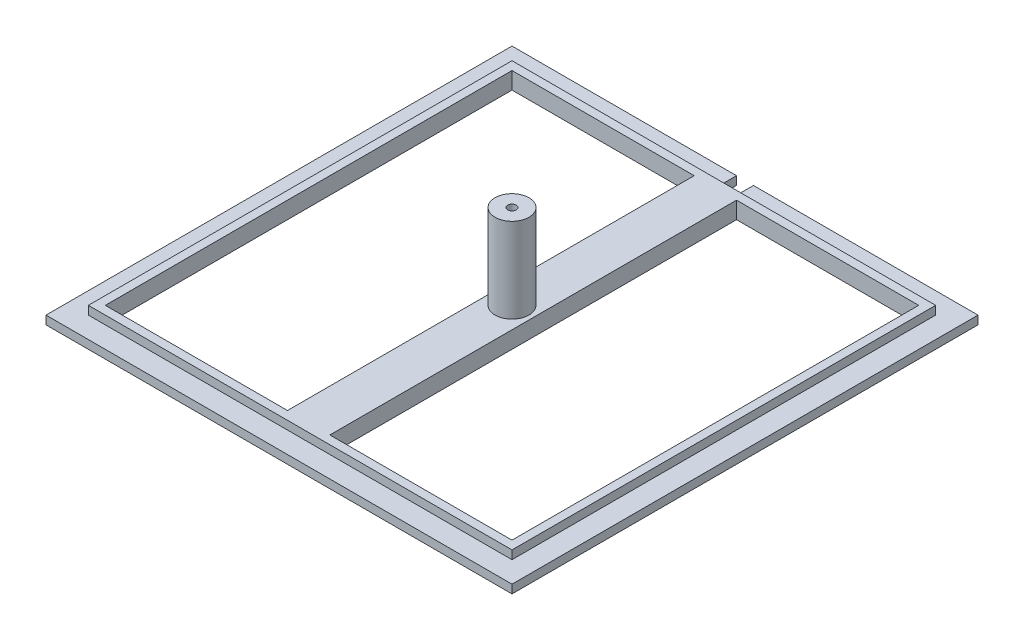
ISO-10303-21;
HEADER;
FILE_DESCRIPTION(('STEP AP214'),'2;1');
FILE_NAME('part.step','',(''),(''),'','','');
FILE_SCHEMA(('AUTOMOTIVE_DESIGN { 1 0 10303 214 1 1 1 1 }'));
ENDSEC;
DATA;
#1=APPLICATION_CONTEXT('core data for automotive mechanical design processes');
#2=APPLICATION_PROTOCOL_DEFINITION('international standard','automotive_design',2000,#1);
#3=PRODUCT_CONTEXT('',#1,'mechanical');
#4=PRODUCT('Part','Part','',(#3));
#5=PRODUCT_RELATED_PRODUCT_CATEGORY('part','',(#4));
#6=PRODUCT_DEFINITION_FORMATION('','',#4);
#7=PRODUCT_DEFINITION_CONTEXT('part definition',#1,'design');
#8=PRODUCT_DEFINITION('design','',#6,#7);
#9=PRODUCT_DEFINITION_SHAPE('','',#8);
#10=(LENGTH_UNIT() NAMED_UNIT(*) SI_UNIT(.MILLI.,.METRE.));
#11=(NAMED_UNIT(*) PLANE_ANGLE_UNIT() SI_UNIT($,.RADIAN.));
#12=(NAMED_UNIT(*) SI_UNIT($,.STERADIAN.) SOLID_ANGLE_UNIT());
#13=UNCERTAINTY_MEASURE_WITH_UNIT(LENGTH_MEASURE(1.E-05),#10,'distance_accuracy_value','');
#14=(GEOMETRIC_REPRESENTATION_CONTEXT(3) GLOBAL_UNCERTAINTY_ASSIGNED_CONTEXT((#13)) GLOBAL_UNIT_ASSIGNED_CONTEXT((#10,
#11,#12)) REPRESENTATION_CONTEXT('',''));
#15=CARTESIAN_POINT('',(0.,0.,0.));
#16=DIRECTION('',(0.,0.,1.));
#17=DIRECTION('',(1.,0.,0.));
#18=AXIS2_PLACEMENT_3D('',#15,#16,#17);
#19=CARTESIAN_POINT('',(-5.,2.,-105.));
#20=DIRECTION('',(0.,0.,1.));
#21=DIRECTION('',(1.,0.,0.));
#22=AXIS2_PLACEMENT_3D('',#19,#20,#21);
#23=PLANE('',#22);
#24=DIRECTION('',(-1.,0.,0.));
#25=VECTOR('',#24,1.);
#26=CARTESIAN_POINT('',(-5.,0.,-105.));
#27=LINE('',#26,#25);
#28=CARTESIAN_POINT('',(105.,0.,-105.));
#29=VERTEX_POINT('',#28);
#30=CARTESIAN_POINT('',(52.,0.,-105.));
#31=VERTEX_POINT('',#30);
#32=EDGE_CURVE('E357',#29,#31,#27,.T.);
#33=ORIENTED_EDGE('',*,*,#32,.T.);
#34=DIRECTION('',(0.,-1.,0.));
#35=VECTOR('',#34,1.);
#36=CARTESIAN_POINT('',(52.,0.,-105.));
#37=LINE('',#36,#35);
#38=CARTESIAN_POINT('',(52.,2.,-105.));
#39=VERTEX_POINT('',#38);
#40=EDGE_CURVE('E194',#39,#31,#37,.T.);
#41=ORIENTED_EDGE('',*,*,#40,.F.);
#42=DIRECTION('',(-1.,0.,0.));
#43=VECTOR('',#42,1.);
#44=CARTESIAN_POINT('',(-5.,2.,-105.));
#45=LINE('',#44,#43);
#46=CARTESIAN_POINT('',(105.,2.,-105.));
#47=VERTEX_POINT('',#46);
#48=EDGE_CURVE('E346',#47,#39,#45,.T.);
#49=ORIENTED_EDGE('',*,*,#48,.F.);
#50=DIRECTION('',(0.,-1.,0.));
#51=VECTOR('',#50,1.);
#52=CARTESIAN_POINT('',(105.,2.,-105.));
#53=LINE('',#52,#51);
#54=EDGE_CURVE('E365',#47,#29,#53,.T.);
#55=ORIENTED_EDGE('',*,*,#54,.T.);
#56=EDGE_LOOP('',(#33,#41,#49,#55));
#57=FACE_BOUND('',#56,.T.);
#58=ADVANCED_FACE('F33',(#57),#23,.F.);
#59=CARTESIAN_POINT('',(98.,4.,-98.));
#60=DIRECTION('',(0.,0.,-1.));
#61=DIRECTION('',(-1.,0.,0.));
#62=AXIS2_PLACEMENT_3D('',#59,#60,#61);
#63=PLANE('',#62);
#64=DIRECTION('',(1.,0.,0.));
#65=VECTOR('',#64,1.);
#66=CARTESIAN_POINT('',(98.,0.,-98.));
#67=LINE('',#66,#65);
#68=CARTESIAN_POINT('',(1.99999999999998,0.,-98.));
#69=VERTEX_POINT('',#68);
#70=CARTESIAN_POINT('',(45.,0.,-98.));
#71=VERTEX_POINT('',#70);
#72=EDGE_CURVE('E271',#69,#71,#67,.T.);
#73=ORIENTED_EDGE('',*,*,#72,.T.);
#74=DIRECTION('',(0.,-1.,0.));
#75=VECTOR('',#74,1.);
#76=CARTESIAN_POINT('',(45.,4.,-98.));
#77=LINE('',#76,#75);
#78=CARTESIAN_POINT('',(45.,4.,-98.));
#79=VERTEX_POINT('',#78);
#80=EDGE_CURVE('E251',#79,#71,#77,.T.);
#81=ORIENTED_EDGE('',*,*,#80,.F.);
#82=DIRECTION('',(1.,0.,0.));
#83=VECTOR('',#82,1.);
#84=CARTESIAN_POINT('',(98.,4.,-98.));
#85=LINE('',#84,#83);
#86=CARTESIAN_POINT('',(1.99999999999998,4.,-98.));
#87=VERTEX_POINT('',#86);
#88=EDGE_CURVE('E278',#87,#79,#85,.T.);
#89=ORIENTED_EDGE('',*,*,#88,.F.);
#90=DIRECTION('',(0.,-1.,0.));
#91=VECTOR('',#90,1.);
#92=CARTESIAN_POINT('',(1.99999999999998,4.,-98.));
#93=LINE('',#92,#91);
#94=EDGE_CURVE('E295',#87,#69,#93,.T.);
#95=ORIENTED_EDGE('',*,*,#94,.T.);
#96=EDGE_LOOP('',(#73,#81,#89,#95));
#97=FACE_BOUND('',#96,.T.);
#98=ADVANCED_FACE('F404',(#97),#63,.F.);
#99=CARTESIAN_POINT('',(1.99999999999998,4.,-2.));
#100=DIRECTION('',(0.,0.,1.));
#101=DIRECTION('',(1.,0.,0.));
#102=AXIS2_PLACEMENT_3D('',#99,#100,#101);
#103=PLANE('',#102);
#104=DIRECTION('',(-1.,0.,0.));
#105=VECTOR('',#104,1.);
#106=CARTESIAN_POINT('',(1.99999999999998,4.,-2.));
#107=LINE('',#106,#105);
#108=CARTESIAN_POINT('',(45.,4.,-2.));
#109=VERTEX_POINT('',#108);
#110=CARTESIAN_POINT('',(1.99999999999998,4.,-2.));
#111=VERTEX_POINT('',#110);
#112=EDGE_CURVE('E270',#109,#111,#107,.T.);
#113=ORIENTED_EDGE('',*,*,#112,.F.);
#114=DIRECTION('',(0.,-1.,0.));
#115=VECTOR('',#114,1.);
#116=CARTESIAN_POINT('',(45.,4.,-2.));
#117=LINE('',#116,#115);
#118=CARTESIAN_POINT('',(45.,0.,-2.));
#119=VERTEX_POINT('',#118);
#120=EDGE_CURVE('E256',#109,#119,#117,.T.);
#121=ORIENTED_EDGE('',*,*,#120,.T.);
#122=DIRECTION('',(-1.,0.,0.));
#123=VECTOR('',#122,1.);
#124=CARTESIAN_POINT('',(1.99999999999998,0.,-2.));
#125=LINE('',#124,#123);
#126=CARTESIAN_POINT('',(1.99999999999998,0.,-2.));
#127=VERTEX_POINT('',#126);
#128=EDGE_CURVE('E283',#119,#127,#125,.T.);
#129=ORIENTED_EDGE('',*,*,#128,.T.);
#130=DIRECTION('',(0.,-1.,0.));
#131=VECTOR('',#130,1.);
#132=CARTESIAN_POINT('',(1.99999999999998,4.,-2.));
#133=LINE('',#132,#131);
#134=EDGE_CURVE('E297',#111,#127,#133,.T.);
#135=ORIENTED_EDGE('',*,*,#134,.F.);
#136=EDGE_LOOP('',(#113,#121,#129,#135));
#137=FACE_BOUND('',#136,.T.);
#138=ADVANCED_FACE('F411',(#137),#103,.F.);
#139=CARTESIAN_POINT('',(0.,2.,0.));
#140=DIRECTION('',(0.,1.,0.));
#141=DIRECTION('',(0.,0.,1.));
#142=AXIS2_PLACEMENT_3D('',#139,#140,#141);
#143=PLANE('',#142);
#144=DIRECTION('',(0.,0.,-1.));
#145=VECTOR('',#144,1.);
#146=CARTESIAN_POINT('',(52.,2.,-50.));
#147=LINE('',#146,#145);
#148=CARTESIAN_POINT('',(52.,2.,-100.));
#149=VERTEX_POINT('',#148);
#150=EDGE_CURVE('E227',#149,#39,#147,.T.);
#151=ORIENTED_EDGE('',*,*,#150,.F.);
#152=DIRECTION('',(-1.,0.,0.));
#153=VECTOR('',#152,1.);
#154=CARTESIAN_POINT('',(0.,2.,-100.));
#155=LINE('',#154,#153);
#156=CARTESIAN_POINT('',(100.,2.,-100.));
#157=VERTEX_POINT('',#156);
#158=EDGE_CURVE('E335',#157,#149,#155,.T.);
#159=ORIENTED_EDGE('',*,*,#158,.F.);
#160=DIRECTION('',(0.,0.,-1.));
#161=VECTOR('',#160,1.);
#162=CARTESIAN_POINT('',(100.,2.,0.));
#163=LINE('',#162,#161);
#164=CARTESIAN_POINT('',(100.,2.,0.));
#165=VERTEX_POINT('',#164);
#166=EDGE_CURVE('E331',#165,#157,#163,.T.);
#167=ORIENTED_EDGE('',*,*,#166,.F.);
#168=DIRECTION('',(1.,0.,0.));
#169=VECTOR('',#168,1.);
#170=CARTESIAN_POINT('',(0.,2.,0.));
#171=LINE('',#170,#169);
#172=CARTESIAN_POINT('',(0.,2.,0.));
#173=VERTEX_POINT('',#172);
#174=EDGE_CURVE('E328',#173,#165,#171,.T.);
#175=ORIENTED_EDGE('',*,*,#174,.F.);
#176=DIRECTION('',(0.,0.,1.));
#177=VECTOR('',#176,1.);
#178=CARTESIAN_POINT('',(0.,2.,0.));
#179=LINE('',#178,#177);
#180=CARTESIAN_POINT('',(0.,2.,-100.));
#181=VERTEX_POINT('',#180);
#182=EDGE_CURVE('E317',#181,#173,#179,.T.);
#183=ORIENTED_EDGE('',*,*,#182,.F.);
#184=CARTESIAN_POINT('',(48.,2.,-100.));
#185=VERTEX_POINT('',#184);
#186=EDGE_CURVE('E334',#185,#181,#155,.T.);
#187=ORIENTED_EDGE('',*,*,#186,.F.);
#188=DIRECTION('',(0.,0.,-1.));
#189=VECTOR('',#188,1.);
#190=CARTESIAN_POINT('',(48.,2.,-50.));
#191=LINE('',#190,#189);
#192=CARTESIAN_POINT('',(48.,2.,-105.));
#193=VERTEX_POINT('',#192);
#194=EDGE_CURVE('E231',#185,#193,#191,.T.);
#195=ORIENTED_EDGE('',*,*,#194,.T.);
#196=CARTESIAN_POINT('',(-5.,2.,-105.));
#197=VERTEX_POINT('',#196);
#198=EDGE_CURVE('E345',#193,#197,#45,.T.);
#199=ORIENTED_EDGE('',*,*,#198,.T.);
#200=DIRECTION('',(0.,0.,1.));
#201=VECTOR('',#200,1.);
#202=CARTESIAN_POINT('',(-5.,2.,5.));
#203=LINE('',#202,#201);
#204=CARTESIAN_POINT('',(-5.,2.,5.));
#205=VERTEX_POINT('',#204);
#206=EDGE_CURVE('E349',#197,#205,#203,.T.);
#207=ORIENTED_EDGE('',*,*,#206,.T.);
#208=DIRECTION('',(1.,0.,0.));
#209=VECTOR('',#208,1.);
#210=CARTESIAN_POINT('',(-5.,2.,5.));
#211=LINE('',#210,#209);
#212=CARTESIAN_POINT('',(105.,2.,5.));
#213=VERTEX_POINT('',#212);
#214=EDGE_CURVE('E339',#205,#213,#211,.T.);
#215=ORIENTED_EDGE('',*,*,#214,.T.);
#216=DIRECTION('',(0.,0.,-1.));
#217=VECTOR('',#216,1.);
#218=CARTESIAN_POINT('',(105.,2.,5.));
#219=LINE('',#218,#217);
#220=EDGE_CURVE('E342',#213,#47,#219,.T.);
#221=ORIENTED_EDGE('',*,*,#220,.T.);
#222=ORIENTED_EDGE('',*,*,#48,.T.);
#223=EDGE_LOOP('',(#151,#159,#167,#175,#183,#187,#195,#199,#207,#215,#221,#222));
#224=FACE_BOUND('',#223,.T.);
#225=ADVANCED_FACE('F434',(#224),#143,.T.);
#226=CARTESIAN_POINT('',(0.,0.,0.));
#227=DIRECTION('',(0.,1.,0.));
#228=DIRECTION('',(0.,0.,1.));
#229=AXIS2_PLACEMENT_3D('',#226,#227,#228);
#230=PLANE('',#229);
#231=CARTESIAN_POINT('',(48.,0.,-105.));
#232=VERTEX_POINT('',#231);
#233=CARTESIAN_POINT('',(-5.,0.,-105.));
#234=VERTEX_POINT('',#233);
#235=EDGE_CURVE('E356',#232,#234,#27,.T.);
#236=ORIENTED_EDGE('',*,*,#235,.F.);
#237=DIRECTION('',(0.,0.,-1.));
#238=VECTOR('',#237,1.);
#239=CARTESIAN_POINT('',(48.,0.,-50.));
#240=LINE('',#239,#238);
#241=CARTESIAN_POINT('',(48.,0.,-50.));
#242=VERTEX_POINT('',#241);
#243=EDGE_CURVE('E198',#242,#232,#240,.T.);
#244=ORIENTED_EDGE('',*,*,#243,.F.);
#245=DIRECTION('',(-1.,0.,0.));
#246=VECTOR('',#245,1.);
#247=CARTESIAN_POINT('',(52.,0.,-50.));
#248=LINE('',#247,#246);
#249=CARTESIAN_POINT('',(49.,0.,-50.));
#250=VERTEX_POINT('',#249);
#251=EDGE_CURVE('E205',#250,#242,#248,.T.);
#252=ORIENTED_EDGE('',*,*,#251,.F.);
#253=CARTESIAN_POINT('',(50.,0.,-50.));
#254=DIRECTION('',(0.,1.,0.));
#255=DIRECTION('',(0.,0.,1.));
#256=AXIS2_PLACEMENT_3D('',#253,#254,#255);
#257=CIRCLE('',#256,0.999999999999998);
#258=CARTESIAN_POINT('',(51.,0.,-50.));
#259=VERTEX_POINT('',#258);
#260=EDGE_CURVE('E214',#250,#259,#257,.T.);
#261=ORIENTED_EDGE('',*,*,#260,.T.);
#262=CARTESIAN_POINT('',(52.,0.,-50.));
#263=VERTEX_POINT('',#262);
#264=EDGE_CURVE('E48',#263,#259,#248,.T.);
#265=ORIENTED_EDGE('',*,*,#264,.F.);
#266=DIRECTION('',(0.,0.,-1.));
#267=VECTOR('',#266,1.);
#268=CARTESIAN_POINT('',(52.,0.,-50.));
#269=LINE('',#268,#267);
#270=EDGE_CURVE('E189',#263,#31,#269,.T.);
#271=ORIENTED_EDGE('',*,*,#270,.T.);
#272=ORIENTED_EDGE('',*,*,#32,.F.);
#273=DIRECTION('',(0.,0.,-1.));
#274=VECTOR('',#273,1.);
#275=CARTESIAN_POINT('',(105.,0.,5.));
#276=LINE('',#275,#274);
#277=CARTESIAN_POINT('',(105.,0.,5.));
#278=VERTEX_POINT('',#277);
#279=EDGE_CURVE('E354',#278,#29,#276,.T.);
#280=ORIENTED_EDGE('',*,*,#279,.F.);
#281=DIRECTION('',(1.,0.,0.));
#282=VECTOR('',#281,1.);
#283=CARTESIAN_POINT('',(-5.,0.,5.));
#284=LINE('',#283,#282);
#285=CARTESIAN_POINT('',(-5.,0.,5.));
#286=VERTEX_POINT('',#285);
#287=EDGE_CURVE('E338',#286,#278,#284,.T.);
#288=ORIENTED_EDGE('',*,*,#287,.F.);
#289=DIRECTION('',(0.,0.,1.));
#290=VECTOR('',#289,1.);
#291=CARTESIAN_POINT('',(-5.,0.,5.));
#292=LINE('',#291,#290);
#293=EDGE_CURVE('E343',#234,#286,#292,.T.);
#294=ORIENTED_EDGE('',*,*,#293,.F.);
#295=EDGE_LOOP('',(#236,#244,#252,#261,#265,#271,#272,#280,#288,#294));
#296=FACE_BOUND('',#295,.T.);
#297=CARTESIAN_POINT('',(55.,0.,-98.));
#298=VERTEX_POINT('',#297);
#299=CARTESIAN_POINT('',(98.,0.,-98.));
#300=VERTEX_POINT('',#299);
#301=EDGE_CURVE('E289',#298,#300,#67,.T.);
#302=ORIENTED_EDGE('',*,*,#301,.F.);
#303=DIRECTION('',(0.,0.,1.));
#304=VECTOR('',#303,1.);
#305=CARTESIAN_POINT('',(55.,0.,-2.));
#306=LINE('',#305,#304);
#307=CARTESIAN_POINT('',(55.,0.,-2.));
#308=VERTEX_POINT('',#307);
#309=EDGE_CURVE('E248',#298,#308,#306,.T.);
#310=ORIENTED_EDGE('',*,*,#309,.T.);
#311=CARTESIAN_POINT('',(98.,0.,-2.));
#312=VERTEX_POINT('',#311);
#313=EDGE_CURVE('E284',#312,#308,#125,.T.);
#314=ORIENTED_EDGE('',*,*,#313,.F.);
#315=DIRECTION('',(0.,0.,1.));
#316=VECTOR('',#315,1.);
#317=CARTESIAN_POINT('',(98.,0.,-2.));
#318=LINE('',#317,#316);
#319=EDGE_CURVE('E259',#300,#312,#318,.T.);
#320=ORIENTED_EDGE('',*,*,#319,.F.);
#321=EDGE_LOOP('',(#302,#310,#314,#320));
#322=FACE_BOUND('',#321,.T.);
#323=DIRECTION('',(0.,0.,-1.));
#324=VECTOR('',#323,1.);
#325=CARTESIAN_POINT('',(45.,0.,-2.));
#326=LINE('',#325,#324);
#327=EDGE_CURVE('E241',#119,#71,#326,.T.);
#328=ORIENTED_EDGE('',*,*,#327,.T.);
#329=ORIENTED_EDGE('',*,*,#72,.F.);
#330=DIRECTION('',(0.,0.,-1.));
#331=VECTOR('',#330,1.);
#332=CARTESIAN_POINT('',(1.99999999999998,0.,-98.));
#333=LINE('',#332,#331);
#334=EDGE_CURVE('E286',#127,#69,#333,.T.);
#335=ORIENTED_EDGE('',*,*,#334,.F.);
#336=ORIENTED_EDGE('',*,*,#128,.F.);
#337=EDGE_LOOP('',(#328,#329,#335,#336));
#338=FACE_BOUND('',#337,.T.);
#339=ADVANCED_FACE('F210',(#296,#322,#338),#230,.F.);
#340=CARTESIAN_POINT('',(-5.,2.,5.));
#341=DIRECTION('',(0.,0.,-1.));
#342=DIRECTION('',(-1.,0.,0.));
#343=AXIS2_PLACEMENT_3D('',#340,#341,#342);
#344=PLANE('',#343);
#345=ORIENTED_EDGE('',*,*,#287,.T.);
#346=DIRECTION('',(0.,-1.,0.));
#347=VECTOR('',#346,1.);
#348=CARTESIAN_POINT('',(105.,2.,5.));
#349=LINE('',#348,#347);
#350=EDGE_CURVE('E368',#213,#278,#349,.T.);
#351=ORIENTED_EDGE('',*,*,#350,.F.);
#352=ORIENTED_EDGE('',*,*,#214,.F.);
#353=DIRECTION('',(0.,-1.,0.));
#354=VECTOR('',#353,1.);
#355=CARTESIAN_POINT('',(-5.,2.,5.));
#356=LINE('',#355,#354);
#357=EDGE_CURVE('E351',#205,#286,#356,.T.);
#358=ORIENTED_EDGE('',*,*,#357,.T.);
#359=EDGE_LOOP('',(#345,#351,#352,#358));
#360=FACE_BOUND('',#359,.T.);
#361=ADVANCED_FACE('F35',(#360),#344,.F.);
#362=CARTESIAN_POINT('',(105.,2.,5.));
#363=DIRECTION('',(-1.,0.,0.));
#364=DIRECTION('',(0.,0.,1.));
#365=AXIS2_PLACEMENT_3D('',#362,#363,#364);
#366=PLANE('',#365);
#367=ORIENTED_EDGE('',*,*,#279,.T.);
#368=ORIENTED_EDGE('',*,*,#54,.F.);
#369=ORIENTED_EDGE('',*,*,#220,.F.);
#370=ORIENTED_EDGE('',*,*,#350,.T.);
#371=EDGE_LOOP('',(#367,#368,#369,#370));
#372=FACE_BOUND('',#371,.T.);
#373=ADVANCED_FACE('F418',(#372),#366,.F.);
#374=ORIENTED_EDGE('',*,*,#198,.F.);
#375=DIRECTION('',(0.,1.,0.));
#376=VECTOR('',#375,1.);
#377=CARTESIAN_POINT('',(48.,0.,-105.));
#378=LINE('',#377,#376);
#379=EDGE_CURVE('E206',#232,#193,#378,.T.);
#380=ORIENTED_EDGE('',*,*,#379,.F.);
#381=ORIENTED_EDGE('',*,*,#235,.T.);
#382=DIRECTION('',(0.,-1.,0.));
#383=VECTOR('',#382,1.);
#384=CARTESIAN_POINT('',(-5.,2.,-105.));
#385=LINE('',#384,#383);
#386=EDGE_CURVE('E362',#197,#234,#385,.T.);
#387=ORIENTED_EDGE('',*,*,#386,.F.);
#388=EDGE_LOOP('',(#374,#380,#381,#387));
#389=FACE_BOUND('',#388,.T.);
#390=ADVANCED_FACE('F407',(#389),#23,.F.);
#391=CARTESIAN_POINT('',(-5.,2.,5.));
#392=DIRECTION('',(1.,0.,0.));
#393=DIRECTION('',(0.,0.,-1.));
#394=AXIS2_PLACEMENT_3D('',#391,#392,#393);
#395=PLANE('',#394);
#396=ORIENTED_EDGE('',*,*,#293,.T.);
#397=ORIENTED_EDGE('',*,*,#357,.F.);
#398=ORIENTED_EDGE('',*,*,#206,.F.);
#399=ORIENTED_EDGE('',*,*,#386,.T.);
#400=EDGE_LOOP('',(#396,#397,#398,#399));
#401=FACE_BOUND('',#400,.T.);
#402=ADVANCED_FACE('F417',(#401),#395,.F.);
#403=CARTESIAN_POINT('',(100.,4.,0.));
#404=DIRECTION('',(1.,0.,0.));
#405=DIRECTION('',(0.,0.,-1.));
#406=AXIS2_PLACEMENT_3D('',#403,#404,#405);
#407=PLANE('',#406);
#408=DIRECTION('',(0.,-1.,0.));
#409=VECTOR('',#408,1.);
#410=CARTESIAN_POINT('',(100.,4.,0.));
#411=LINE('',#410,#409);
#412=CARTESIAN_POINT('',(100.,4.,0.));
#413=VERTEX_POINT('',#412);
#414=EDGE_CURVE('E313',#413,#165,#411,.T.);
#415=ORIENTED_EDGE('',*,*,#414,.T.);
#416=ORIENTED_EDGE('',*,*,#166,.T.);
#417=DIRECTION('',(0.,-1.,0.));
#418=VECTOR('',#417,1.);
#419=CARTESIAN_POINT('',(100.,4.,-100.));
#420=LINE('',#419,#418);
#421=CARTESIAN_POINT('',(100.,4.,-100.));
#422=VERTEX_POINT('',#421);
#423=EDGE_CURVE('E314',#422,#157,#420,.T.);
#424=ORIENTED_EDGE('',*,*,#423,.F.);
#425=DIRECTION('',(0.,0.,1.));
#426=VECTOR('',#425,1.);
#427=CARTESIAN_POINT('',(100.,4.,0.));
#428=LINE('',#427,#426);
#429=EDGE_CURVE('E294',#422,#413,#428,.T.);
#430=ORIENTED_EDGE('',*,*,#429,.T.);
#431=EDGE_LOOP('',(#415,#416,#424,#430));
#432=FACE_BOUND('',#431,.T.);
#433=ADVANCED_FACE('F424',(#432),#407,.T.);
#434=CARTESIAN_POINT('',(100.,4.,-100.));
#435=DIRECTION('',(0.,0.,-1.));
#436=DIRECTION('',(-1.,0.,0.));
#437=AXIS2_PLACEMENT_3D('',#434,#435,#436);
#438=PLANE('',#437);
#439=ORIENTED_EDGE('',*,*,#423,.T.);
#440=ORIENTED_EDGE('',*,*,#158,.T.);
#441=DIRECTION('',(1.,0.,0.));
#442=VECTOR('',#441,1.);
#443=CARTESIAN_POINT('',(100.,2.,-100.));
#444=LINE('',#443,#442);
#445=EDGE_CURVE('E226',#185,#149,#444,.T.);
#446=ORIENTED_EDGE('',*,*,#445,.F.);
#447=ORIENTED_EDGE('',*,*,#186,.T.);
#448=DIRECTION('',(0.,-1.,0.));
#449=VECTOR('',#448,1.);
#450=CARTESIAN_POINT('',(0.,4.,-100.));
#451=LINE('',#450,#449);
#452=CARTESIAN_POINT('',(0.,4.,-100.));
#453=VERTEX_POINT('',#452);
#454=EDGE_CURVE('E318',#453,#181,#451,.T.);
#455=ORIENTED_EDGE('',*,*,#454,.F.);
#456=DIRECTION('',(1.,0.,0.));
#457=VECTOR('',#456,1.);
#458=CARTESIAN_POINT('',(100.,4.,-100.));
#459=LINE('',#458,#457);
#460=EDGE_CURVE('E310',#453,#422,#459,.T.);
#461=ORIENTED_EDGE('',*,*,#460,.T.);
#462=EDGE_LOOP('',(#439,#440,#446,#447,#455,#461));
#463=FACE_BOUND('',#462,.T.);
#464=ADVANCED_FACE('F443',(#463),#438,.T.);
#465=CARTESIAN_POINT('',(0.,4.,-100.));
#466=DIRECTION('',(-1.,0.,0.));
#467=DIRECTION('',(0.,0.,1.));
#468=AXIS2_PLACEMENT_3D('',#465,#466,#467);
#469=PLANE('',#468);
#470=ORIENTED_EDGE('',*,*,#454,.T.);
#471=ORIENTED_EDGE('',*,*,#182,.T.);
#472=DIRECTION('',(0.,-1.,0.));
#473=VECTOR('',#472,1.);
#474=CARTESIAN_POINT('',(0.,4.,0.));
#475=LINE('',#474,#473);
#476=CARTESIAN_POINT('',(0.,4.,0.));
#477=VERTEX_POINT('',#476);
#478=EDGE_CURVE('E321',#477,#173,#475,.T.);
#479=ORIENTED_EDGE('',*,*,#478,.F.);
#480=DIRECTION('',(0.,0.,-1.));
#481=VECTOR('',#480,1.);
#482=CARTESIAN_POINT('',(0.,4.,-100.));
#483=LINE('',#482,#481);
#484=EDGE_CURVE('E307',#477,#453,#483,.T.);
#485=ORIENTED_EDGE('',*,*,#484,.T.);
#486=EDGE_LOOP('',(#470,#471,#479,#485));
#487=FACE_BOUND('',#486,.T.);
#488=ADVANCED_FACE('F454',(#487),#469,.T.);
#489=CARTESIAN_POINT('',(0.,4.,0.));
#490=DIRECTION('',(0.,0.,1.));
#491=DIRECTION('',(1.,0.,0.));
#492=AXIS2_PLACEMENT_3D('',#489,#490,#491);
#493=PLANE('',#492);
#494=ORIENTED_EDGE('',*,*,#478,.T.);
#495=ORIENTED_EDGE('',*,*,#174,.T.);
#496=ORIENTED_EDGE('',*,*,#414,.F.);
#497=DIRECTION('',(-1.,0.,0.));
#498=VECTOR('',#497,1.);
#499=CARTESIAN_POINT('',(0.,4.,0.));
#500=LINE('',#499,#498);
#501=EDGE_CURVE('E304',#413,#477,#500,.T.);
#502=ORIENTED_EDGE('',*,*,#501,.T.);
#503=EDGE_LOOP('',(#494,#495,#496,#502));
#504=FACE_BOUND('',#503,.T.);
#505=ADVANCED_FACE('F452',(#504),#493,.T.);
#506=CARTESIAN_POINT('',(0.,4.,0.));
#507=DIRECTION('',(0.,1.,0.));
#508=DIRECTION('',(0.,0.,1.));
#509=AXIS2_PLACEMENT_3D('',#506,#507,#508);
#510=PLANE('',#509);
#511=CARTESIAN_POINT('',(50.,4.,-50.));
#512=DIRECTION('',(0.,1.,0.));
#513=DIRECTION('',(0.,0.,1.));
#514=AXIS2_PLACEMENT_3D('',#511,#512,#513);
#515=CIRCLE('',#514,4.);
#516=CARTESIAN_POINT('',(50.,4.,-46.));
#517=VERTEX_POINT('',#516);
#518=EDGE_CURVE('E237',#517,#517,#515,.T.);
#519=ORIENTED_EDGE('',*,*,#518,.F.);
#520=EDGE_LOOP('',(#519));
#521=FACE_BOUND('',#520,.T.);
#522=DIRECTION('',(0.,0.,1.));
#523=VECTOR('',#522,1.);
#524=CARTESIAN_POINT('',(55.,4.,-2.));
#525=LINE('',#524,#523);
#526=CARTESIAN_POINT('',(55.,4.,-98.));
#527=VERTEX_POINT('',#526);
#528=CARTESIAN_POINT('',(55.,4.,-2.));
#529=VERTEX_POINT('',#528);
#530=EDGE_CURVE('E247',#527,#529,#525,.T.);
#531=ORIENTED_EDGE('',*,*,#530,.F.);
#532=CARTESIAN_POINT('',(98.,4.,-98.));
#533=VERTEX_POINT('',#532);
#534=EDGE_CURVE('E56',#527,#533,#85,.T.);
#535=ORIENTED_EDGE('',*,*,#534,.T.);
#536=DIRECTION('',(0.,0.,1.));
#537=VECTOR('',#536,1.);
#538=CARTESIAN_POINT('',(98.,4.,-2.));
#539=LINE('',#538,#537);
#540=CARTESIAN_POINT('',(98.,4.,-2.));
#541=VERTEX_POINT('',#540);
#542=EDGE_CURVE('E267',#533,#541,#539,.T.);
#543=ORIENTED_EDGE('',*,*,#542,.T.);
#544=EDGE_CURVE('E272',#541,#529,#107,.T.);
#545=ORIENTED_EDGE('',*,*,#544,.T.);
#546=EDGE_LOOP('',(#531,#535,#543,#545));
#547=FACE_BOUND('',#546,.T.);
#548=ORIENTED_EDGE('',*,*,#88,.T.);
#549=DIRECTION('',(0.,0.,-1.));
#550=VECTOR('',#549,1.);
#551=CARTESIAN_POINT('',(45.,4.,-2.));
#552=LINE('',#551,#550);
#553=EDGE_CURVE('E244',#109,#79,#552,.T.);
#554=ORIENTED_EDGE('',*,*,#553,.F.);
#555=ORIENTED_EDGE('',*,*,#112,.T.);
#556=DIRECTION('',(0.,0.,-1.));
#557=VECTOR('',#556,1.);
#558=CARTESIAN_POINT('',(1.99999999999998,4.,-98.));
#559=LINE('',#558,#557);
#560=EDGE_CURVE('E275',#111,#87,#559,.T.);
#561=ORIENTED_EDGE('',*,*,#560,.T.);
#562=EDGE_LOOP('',(#548,#554,#555,#561));
#563=FACE_BOUND('',#562,.T.);
#564=ORIENTED_EDGE('',*,*,#429,.F.);
#565=ORIENTED_EDGE('',*,*,#460,.F.);
#566=ORIENTED_EDGE('',*,*,#484,.F.);
#567=ORIENTED_EDGE('',*,*,#501,.F.);
#568=EDGE_LOOP('',(#564,#565,#566,#567));
#569=FACE_BOUND('',#568,.T.);
#570=ADVANCED_FACE('F449',(#521,#547,#563,#569),#510,.T.);
#571=CARTESIAN_POINT('',(98.,4.,-2.));
#572=DIRECTION('',(1.,0.,0.));
#573=DIRECTION('',(0.,0.,-1.));
#574=AXIS2_PLACEMENT_3D('',#571,#572,#573);
#575=PLANE('',#574);
#576=ORIENTED_EDGE('',*,*,#319,.T.);
#577=DIRECTION('',(0.,-1.,0.));
#578=VECTOR('',#577,1.);
#579=CARTESIAN_POINT('',(98.,4.,-2.));
#580=LINE('',#579,#578);
#581=EDGE_CURVE('E281',#541,#312,#580,.T.);
#582=ORIENTED_EDGE('',*,*,#581,.F.);
#583=ORIENTED_EDGE('',*,*,#542,.F.);
#584=DIRECTION('',(0.,-1.,0.));
#585=VECTOR('',#584,1.);
#586=CARTESIAN_POINT('',(98.,4.,-98.));
#587=LINE('',#586,#585);
#588=EDGE_CURVE('E291',#533,#300,#587,.T.);
#589=ORIENTED_EDGE('',*,*,#588,.T.);
#590=EDGE_LOOP('',(#576,#582,#583,#589));
#591=FACE_BOUND('',#590,.T.);
#592=ADVANCED_FACE('F518',(#591),#575,.F.);
#593=ORIENTED_EDGE('',*,*,#534,.F.);
#594=DIRECTION('',(0.,-1.,0.));
#595=VECTOR('',#594,1.);
#596=CARTESIAN_POINT('',(55.,4.,-98.));
#597=LINE('',#596,#595);
#598=EDGE_CURVE('E263',#527,#298,#597,.T.);
#599=ORIENTED_EDGE('',*,*,#598,.T.);
#600=ORIENTED_EDGE('',*,*,#301,.T.);
#601=ORIENTED_EDGE('',*,*,#588,.F.);
#602=EDGE_LOOP('',(#593,#599,#600,#601));
#603=FACE_BOUND('',#602,.T.);
#604=ADVANCED_FACE('F414',(#603),#63,.F.);
#605=CARTESIAN_POINT('',(1.99999999999998,4.,-98.));
#606=DIRECTION('',(-1.,0.,0.));
#607=DIRECTION('',(0.,0.,1.));
#608=AXIS2_PLACEMENT_3D('',#605,#606,#607);
#609=PLANE('',#608);
#610=ORIENTED_EDGE('',*,*,#334,.T.);
#611=ORIENTED_EDGE('',*,*,#94,.F.);
#612=ORIENTED_EDGE('',*,*,#560,.F.);
#613=ORIENTED_EDGE('',*,*,#134,.T.);
#614=EDGE_LOOP('',(#610,#611,#612,#613));
#615=FACE_BOUND('',#614,.T.);
#616=ADVANCED_FACE('F530',(#615),#609,.F.);
#617=ORIENTED_EDGE('',*,*,#313,.T.);
#618=DIRECTION('',(0.,-1.,0.));
#619=VECTOR('',#618,1.);
#620=CARTESIAN_POINT('',(55.,4.,-2.));
#621=LINE('',#620,#619);
#622=EDGE_CURVE('E260',#529,#308,#621,.T.);
#623=ORIENTED_EDGE('',*,*,#622,.F.);
#624=ORIENTED_EDGE('',*,*,#544,.F.);
#625=ORIENTED_EDGE('',*,*,#581,.T.);
#626=EDGE_LOOP('',(#617,#623,#624,#625));
#627=FACE_BOUND('',#626,.T.);
#628=ADVANCED_FACE('F535',(#627),#103,.F.);
#629=CARTESIAN_POINT('',(45.,4.,-2.));
#630=DIRECTION('',(-1.,0.,0.));
#631=DIRECTION('',(0.,0.,1.));
#632=AXIS2_PLACEMENT_3D('',#629,#630,#631);
#633=PLANE('',#632);
#634=ORIENTED_EDGE('',*,*,#327,.F.);
#635=ORIENTED_EDGE('',*,*,#120,.F.);
#636=ORIENTED_EDGE('',*,*,#553,.T.);
#637=ORIENTED_EDGE('',*,*,#80,.T.);
#638=EDGE_LOOP('',(#634,#635,#636,#637));
#639=FACE_BOUND('',#638,.T.);
#640=ADVANCED_FACE('F400',(#639),#633,.T.);
#641=CARTESIAN_POINT('',(55.,4.,-2.));
#642=DIRECTION('',(1.,0.,0.));
#643=DIRECTION('',(0.,0.,-1.));
#644=AXIS2_PLACEMENT_3D('',#641,#642,#643);
#645=PLANE('',#644);
#646=ORIENTED_EDGE('',*,*,#309,.F.);
#647=ORIENTED_EDGE('',*,*,#598,.F.);
#648=ORIENTED_EDGE('',*,*,#530,.T.);
#649=ORIENTED_EDGE('',*,*,#622,.T.);
#650=EDGE_LOOP('',(#646,#647,#648,#649));
#651=FACE_BOUND('',#650,.T.);
#652=ADVANCED_FACE('F391',(#651),#645,.T.);
#653=CARTESIAN_POINT('',(50.,24.,-50.));
#654=DIRECTION('',(0.,1.,0.));
#655=DIRECTION('',(0.,0.,1.));
#656=AXIS2_PLACEMENT_3D('',#653,#654,#655);
#657=PLANE('',#656);
#658=CARTESIAN_POINT('',(50.,24.,-50.));
#659=DIRECTION('',(0.,1.,0.));
#660=DIRECTION('',(0.,0.,1.));
#661=AXIS2_PLACEMENT_3D('',#658,#659,#660);
#662=CIRCLE('',#661,4.);
#663=CARTESIAN_POINT('',(50.,24.,-46.));
#664=VERTEX_POINT('',#663);
#665=EDGE_CURVE('E238',#664,#664,#662,.T.);
#666=ORIENTED_EDGE('',*,*,#665,.T.);
#667=EDGE_LOOP('',(#666));
#668=FACE_BOUND('',#667,.T.);
#669=CARTESIAN_POINT('',(50.,24.,-50.));
#670=DIRECTION('',(0.,1.,0.));
#671=DIRECTION('',(0.,0.,1.));
#672=AXIS2_PLACEMENT_3D('',#669,#670,#671);
#673=CIRCLE('',#672,0.999999999999998);
#674=CARTESIAN_POINT('',(50.,24.,-49.));
#675=VERTEX_POINT('',#674);
#676=EDGE_CURVE('E234',#675,#675,#673,.T.);
#677=ORIENTED_EDGE('',*,*,#676,.F.);
#678=EDGE_LOOP('',(#677));
#679=FACE_BOUND('',#678,.T.);
#680=ADVANCED_FACE('F389',(#668,#679),#657,.T.);
#681=CARTESIAN_POINT('',(50.,24.,-50.));
#682=DIRECTION('',(0.,-1.,0.));
#683=DIRECTION('',(0.,0.,-1.));
#684=AXIS2_PLACEMENT_3D('',#681,#682,#683);
#685=CYLINDRICAL_SURFACE('',#684,4.);
#686=ORIENTED_EDGE('',*,*,#665,.F.);
#687=EDGE_LOOP('',(#686));
#688=FACE_BOUND('',#687,.T.);
#689=ORIENTED_EDGE('',*,*,#518,.T.);
#690=EDGE_LOOP('',(#689));
#691=FACE_BOUND('',#690,.T.);
#692=ADVANCED_FACE('F385',(#688,#691),#685,.T.);
#693=CARTESIAN_POINT('',(50.,24.,-50.));
#694=DIRECTION('',(0.,-1.,0.));
#695=DIRECTION('',(0.,0.,-1.));
#696=AXIS2_PLACEMENT_3D('',#693,#694,#695);
#697=CYLINDRICAL_SURFACE('',#696,0.999999999999998);
#698=DIRECTION('',(0.,-1.,0.));
#699=VECTOR('',#698,1.);
#700=CARTESIAN_POINT('',(49.,24.,-50.));
#701=LINE('',#700,#699);
#702=CARTESIAN_POINT('',(49.,2.,-50.));
#703=VERTEX_POINT('',#702);
#704=EDGE_CURVE('E11',#703,#250,#701,.T.);
#705=ORIENTED_EDGE('',*,*,#704,.F.);
#706=CARTESIAN_POINT('',(50.,2.,-50.));
#707=DIRECTION('',(0.,1.,0.));
#708=DIRECTION('',(0.,0.,1.));
#709=AXIS2_PLACEMENT_3D('',#706,#707,#708);
#710=CIRCLE('',#709,0.999999999999998);
#711=CARTESIAN_POINT('',(51.,2.,-50.));
#712=VERTEX_POINT('',#711);
#713=EDGE_CURVE('E41',#712,#703,#710,.T.);
#714=ORIENTED_EDGE('',*,*,#713,.F.);
#715=DIRECTION('',(0.,-1.,0.));
#716=VECTOR('',#715,1.);
#717=CARTESIAN_POINT('',(51.,24.,-50.));
#718=LINE('',#717,#716);
#719=EDGE_CURVE('E371',#259,#712,#718,.F.);
#720=ORIENTED_EDGE('',*,*,#719,.F.);
#721=ORIENTED_EDGE('',*,*,#260,.F.);
#722=EDGE_LOOP('',(#705,#714,#720,#721));
#723=FACE_BOUND('',#722,.T.);
#724=ORIENTED_EDGE('',*,*,#676,.T.);
#725=EDGE_LOOP('',(#724));
#726=FACE_BOUND('',#725,.T.);
#727=ADVANCED_FACE('F382',(#723,#726),#697,.F.);
#728=CARTESIAN_POINT('',(0.,0.,-50.));
#729=DIRECTION('',(0.,0.,1.));
#730=DIRECTION('',(1.,0.,0.));
#731=AXIS2_PLACEMENT_3D('',#728,#729,#730);
#732=PLANE('',#731);
#733=ORIENTED_EDGE('',*,*,#704,.T.);
#734=ORIENTED_EDGE('',*,*,#251,.T.);
#735=DIRECTION('',(0.,1.,0.));
#736=VECTOR('',#735,1.);
#737=CARTESIAN_POINT('',(48.,0.,-50.));
#738=LINE('',#737,#736);
#739=CARTESIAN_POINT('',(48.,2.,-50.));
#740=VERTEX_POINT('',#739);
#741=EDGE_CURVE('E215',#242,#740,#738,.T.);
#742=ORIENTED_EDGE('',*,*,#741,.T.);
#743=DIRECTION('',(1.,0.,0.));
#744=VECTOR('',#743,1.);
#745=CARTESIAN_POINT('',(52.,2.,-50.));
#746=LINE('',#745,#744);
#747=EDGE_CURVE('E199',#740,#703,#746,.T.);
#748=ORIENTED_EDGE('',*,*,#747,.T.);
#749=EDGE_LOOP('',(#733,#734,#742,#748));
#750=FACE_BOUND('',#749,.T.);
#751=ADVANCED_FACE('F380',(#750),#732,.F.);
#752=CARTESIAN_POINT('',(52.,0.,-50.));
#753=DIRECTION('',(1.,0.,0.));
#754=DIRECTION('',(0.,0.,-1.));
#755=AXIS2_PLACEMENT_3D('',#752,#753,#754);
#756=PLANE('',#755);
#757=ORIENTED_EDGE('',*,*,#40,.T.);
#758=ORIENTED_EDGE('',*,*,#270,.F.);
#759=DIRECTION('',(0.,-1.,0.));
#760=VECTOR('',#759,1.);
#761=CARTESIAN_POINT('',(52.,0.,-50.));
#762=LINE('',#761,#760);
#763=CARTESIAN_POINT('',(52.,2.,-50.));
#764=VERTEX_POINT('',#763);
#765=EDGE_CURVE('E192',#764,#263,#762,.T.);
#766=ORIENTED_EDGE('',*,*,#765,.F.);
#767=EDGE_CURVE('E224',#764,#149,#147,.T.);
#768=ORIENTED_EDGE('',*,*,#767,.T.);
#769=ORIENTED_EDGE('',*,*,#150,.T.);
#770=EDGE_LOOP('',(#757,#758,#766,#768,#769));
#771=FACE_BOUND('',#770,.T.);
#772=ADVANCED_FACE('F190',(#771),#756,.F.);
#773=CARTESIAN_POINT('',(52.,2.,-50.));
#774=DIRECTION('',(0.,1.,0.));
#775=DIRECTION('',(0.,0.,1.));
#776=AXIS2_PLACEMENT_3D('',#773,#774,#775);
#777=PLANE('',#776);
#778=ORIENTED_EDGE('',*,*,#445,.T.);
#779=ORIENTED_EDGE('',*,*,#767,.F.);
#780=EDGE_CURVE('E203',#712,#764,#746,.T.);
#781=ORIENTED_EDGE('',*,*,#780,.F.);
#782=ORIENTED_EDGE('',*,*,#713,.T.);
#783=ORIENTED_EDGE('',*,*,#747,.F.);
#784=EDGE_CURVE('E228',#740,#185,#191,.T.);
#785=ORIENTED_EDGE('',*,*,#784,.T.);
#786=EDGE_LOOP('',(#778,#779,#781,#782,#783,#785));
#787=FACE_BOUND('',#786,.T.);
#788=ADVANCED_FACE('F376',(#787),#777,.F.);
#789=CARTESIAN_POINT('',(48.,0.,-50.));
#790=DIRECTION('',(-1.,0.,0.));
#791=DIRECTION('',(0.,0.,1.));
#792=AXIS2_PLACEMENT_3D('',#789,#790,#791);
#793=PLANE('',#792);
#794=ORIENTED_EDGE('',*,*,#379,.T.);
#795=ORIENTED_EDGE('',*,*,#194,.F.);
#796=ORIENTED_EDGE('',*,*,#784,.F.);
#797=ORIENTED_EDGE('',*,*,#741,.F.);
#798=ORIENTED_EDGE('',*,*,#243,.T.);
#799=EDGE_LOOP('',(#794,#795,#796,#797,#798));
#800=FACE_BOUND('',#799,.T.);
#801=ADVANCED_FACE('F440',(#800),#793,.F.);
#802=ORIENTED_EDGE('',*,*,#719,.T.);
#803=ORIENTED_EDGE('',*,*,#780,.T.);
#804=ORIENTED_EDGE('',*,*,#765,.T.);
#805=ORIENTED_EDGE('',*,*,#264,.T.);
#806=EDGE_LOOP('',(#802,#803,#804,#805));
#807=FACE_BOUND('',#806,.T.);
#808=ADVANCED_FACE('F201',(#807),#732,.F.);
#809=CLOSED_SHELL('',(#58,#98,#138,#225,#339,#361,#373,#390,#402,#433,#464,#488,#505,#570,#592,
#604,#616,#628,#640,#652,#680,#692,#727,#751,#772,#788,#801,#808));
#810=MANIFOLD_SOLID_BREP('B2',#809);
#811=ADVANCED_BREP_SHAPE_REPRESENTATION('',(#18,#810),#14);
#812=SHAPE_DEFINITION_REPRESENTATION(#9,#811);
ENDSEC;
END-ISO-10303-21;
